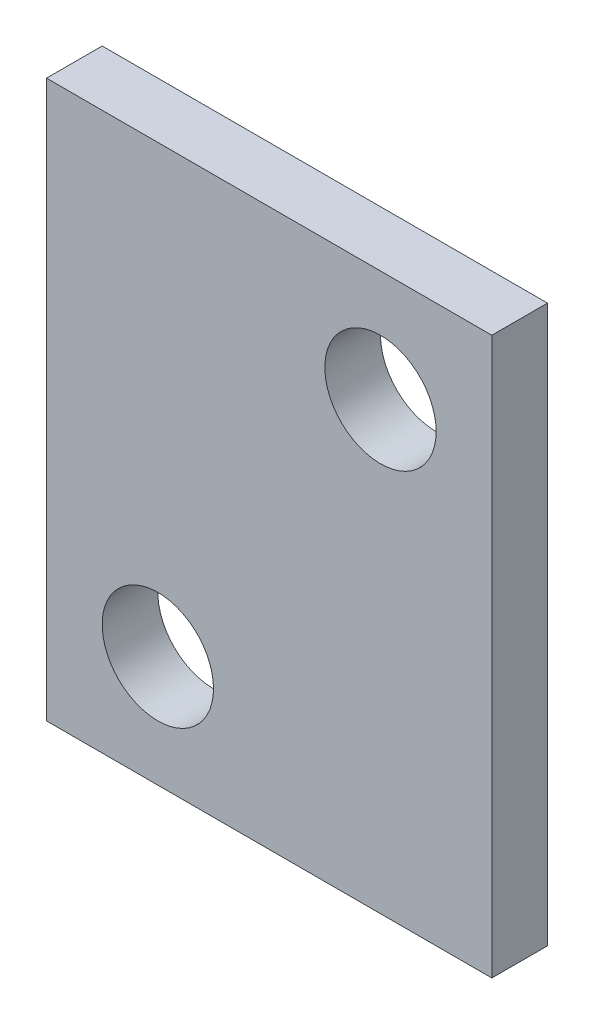
ISO-10303-21;
HEADER;
FILE_DESCRIPTION(('STEP AP214'),'2;1');
FILE_NAME('part.step','',(''),(''),'','','');
FILE_SCHEMA(('AUTOMOTIVE_DESIGN { 1 0 10303 214 1 1 1 1 }'));
ENDSEC;
DATA;
#1=APPLICATION_CONTEXT('core data for automotive mechanical design processes');
#2=APPLICATION_PROTOCOL_DEFINITION('international standard','automotive_design',2000,#1);
#3=PRODUCT_CONTEXT('',#1,'mechanical');
#4=PRODUCT('Part','Part','',(#3));
#5=PRODUCT_RELATED_PRODUCT_CATEGORY('part','',(#4));
#6=PRODUCT_DEFINITION_FORMATION('','',#4);
#7=PRODUCT_DEFINITION_CONTEXT('part definition',#1,'design');
#8=PRODUCT_DEFINITION('design','',#6,#7);
#9=PRODUCT_DEFINITION_SHAPE('','',#8);
#10=(LENGTH_UNIT() NAMED_UNIT(*) SI_UNIT(.MILLI.,.METRE.));
#11=(NAMED_UNIT(*) PLANE_ANGLE_UNIT() SI_UNIT($,.RADIAN.));
#12=(NAMED_UNIT(*) SI_UNIT($,.STERADIAN.) SOLID_ANGLE_UNIT());
#13=UNCERTAINTY_MEASURE_WITH_UNIT(LENGTH_MEASURE(1.E-05),#10,'distance_accuracy_value','');
#14=(GEOMETRIC_REPRESENTATION_CONTEXT(3) GLOBAL_UNCERTAINTY_ASSIGNED_CONTEXT((#13)) GLOBAL_UNIT_ASSIGNED_CONTEXT((#10,
#11,#12)) REPRESENTATION_CONTEXT('',''));
#15=CARTESIAN_POINT('',(0.,0.,0.));
#16=DIRECTION('',(0.,0.,1.));
#17=DIRECTION('',(1.,0.,0.));
#18=AXIS2_PLACEMENT_3D('',#15,#16,#17);
#19=CARTESIAN_POINT('',(-15.520602371608,-4.70345377258236,1.5));
#20=DIRECTION('',(0.,0.,1.));
#21=DIRECTION('',(1.,0.,0.));
#22=AXIS2_PLACEMENT_3D('',#19,#20,#21);
#23=PLANE('',#22);
#24=CARTESIAN_POINT('',(-6.52060237160802,7.29654622741764,1.5));
#25=DIRECTION('',(0.,0.,1.));
#26=DIRECTION('',(1.,0.,0.));
#27=AXIS2_PLACEMENT_3D('',#24,#25,#26);
#28=CIRCLE('',#27,1.5);
#29=CARTESIAN_POINT('',(-5.02060237160802,7.29654622741764,1.5));
#30=VERTEX_POINT('',#29);
#31=EDGE_CURVE('E97',#30,#30,#28,.T.);
#32=ORIENTED_EDGE('',*,*,#31,.F.);
#33=EDGE_LOOP('',(#32));
#34=FACE_BOUND('',#33,.T.);
#35=DIRECTION('',(0.,-1.,0.));
#36=VECTOR('',#35,1.);
#37=CARTESIAN_POINT('',(-15.520602371608,10.2965462274176,1.5));
#38=LINE('',#37,#36);
#39=CARTESIAN_POINT('',(-15.520602371608,10.2965462274176,1.5));
#40=VERTEX_POINT('',#39);
#41=CARTESIAN_POINT('',(-15.520602371608,-4.70345377258236,1.5));
#42=VERTEX_POINT('',#41);
#43=EDGE_CURVE('E82',#40,#42,#38,.T.);
#44=ORIENTED_EDGE('',*,*,#43,.T.);
#45=DIRECTION('',(1.,0.,0.));
#46=VECTOR('',#45,1.);
#47=CARTESIAN_POINT('',(-15.520602371608,-4.70345377258236,1.5));
#48=LINE('',#47,#46);
#49=CARTESIAN_POINT('',(-3.52060237160802,-4.70345377258236,1.5));
#50=VERTEX_POINT('',#49);
#51=EDGE_CURVE('E77',#42,#50,#48,.T.);
#52=ORIENTED_EDGE('',*,*,#51,.T.);
#53=DIRECTION('',(0.,1.,0.));
#54=VECTOR('',#53,1.);
#55=CARTESIAN_POINT('',(-3.52060237160802,10.2965462274176,1.5));
#56=LINE('',#55,#54);
#57=CARTESIAN_POINT('',(-3.52060237160802,10.2965462274176,1.5));
#58=VERTEX_POINT('',#57);
#59=EDGE_CURVE('E80',#50,#58,#56,.T.);
#60=ORIENTED_EDGE('',*,*,#59,.T.);
#61=DIRECTION('',(-1.,0.,0.));
#62=VECTOR('',#61,1.);
#63=CARTESIAN_POINT('',(-15.520602371608,10.2965462274176,1.5));
#64=LINE('',#63,#62);
#65=EDGE_CURVE('E47',#58,#40,#64,.T.);
#66=ORIENTED_EDGE('',*,*,#65,.T.);
#67=EDGE_LOOP('',(#44,#52,#60,#66));
#68=FACE_BOUND('',#67,.T.);
#69=CARTESIAN_POINT('',(-12.520602371608,-1.70345377258236,1.5));
#70=DIRECTION('',(0.,0.,1.));
#71=DIRECTION('',(1.,0.,0.));
#72=AXIS2_PLACEMENT_3D('',#69,#70,#71);
#73=CIRCLE('',#72,1.5);
#74=CARTESIAN_POINT('',(-11.020602371608,-1.70345377258236,1.5));
#75=VERTEX_POINT('',#74);
#76=EDGE_CURVE('E112',#75,#75,#73,.T.);
#77=ORIENTED_EDGE('',*,*,#76,.F.);
#78=EDGE_LOOP('',(#77));
#79=FACE_BOUND('',#78,.T.);
#80=ADVANCED_FACE('F30',(#34,#68,#79),#23,.T.);
#81=CARTESIAN_POINT('',(-15.520602371608,-4.70345377258236,0.));
#82=DIRECTION('',(0.,0.,1.));
#83=DIRECTION('',(1.,0.,0.));
#84=AXIS2_PLACEMENT_3D('',#81,#82,#83);
#85=PLANE('',#84);
#86=CARTESIAN_POINT('',(-6.52060237160802,7.29654622741764,0.));
#87=DIRECTION('',(0.,0.,1.));
#88=DIRECTION('',(1.,0.,0.));
#89=AXIS2_PLACEMENT_3D('',#86,#87,#88);
#90=CIRCLE('',#89,1.5);
#91=CARTESIAN_POINT('',(-5.02060237160802,7.29654622741764,0.));
#92=VERTEX_POINT('',#91);
#93=EDGE_CURVE('E109',#92,#92,#90,.T.);
#94=ORIENTED_EDGE('',*,*,#93,.T.);
#95=EDGE_LOOP('',(#94));
#96=FACE_BOUND('',#95,.T.);
#97=DIRECTION('',(0.,-1.,0.));
#98=VECTOR('',#97,1.);
#99=CARTESIAN_POINT('',(-15.520602371608,10.2965462274176,0.));
#100=LINE('',#99,#98);
#101=CARTESIAN_POINT('',(-15.520602371608,10.2965462274176,0.));
#102=VERTEX_POINT('',#101);
#103=CARTESIAN_POINT('',(-15.520602371608,-4.70345377258236,0.));
#104=VERTEX_POINT('',#103);
#105=EDGE_CURVE('E94',#102,#104,#100,.T.);
#106=ORIENTED_EDGE('',*,*,#105,.F.);
#107=DIRECTION('',(-1.,0.,0.));
#108=VECTOR('',#107,1.);
#109=CARTESIAN_POINT('',(-15.520602371608,10.2965462274176,0.));
#110=LINE('',#109,#108);
#111=CARTESIAN_POINT('',(-3.52060237160802,10.2965462274176,0.));
#112=VERTEX_POINT('',#111);
#113=EDGE_CURVE('E70',#112,#102,#110,.T.);
#114=ORIENTED_EDGE('',*,*,#113,.F.);
#115=DIRECTION('',(0.,1.,0.));
#116=VECTOR('',#115,1.);
#117=CARTESIAN_POINT('',(-3.52060237160802,10.2965462274176,0.));
#118=LINE('',#117,#116);
#119=CARTESIAN_POINT('',(-3.52060237160802,-4.70345377258236,0.));
#120=VERTEX_POINT('',#119);
#121=EDGE_CURVE('E64',#120,#112,#118,.T.);
#122=ORIENTED_EDGE('',*,*,#121,.F.);
#123=DIRECTION('',(1.,0.,0.));
#124=VECTOR('',#123,1.);
#125=CARTESIAN_POINT('',(-15.520602371608,-4.70345377258236,0.));
#126=LINE('',#125,#124);
#127=EDGE_CURVE('E86',#104,#120,#126,.T.);
#128=ORIENTED_EDGE('',*,*,#127,.F.);
#129=EDGE_LOOP('',(#106,#114,#122,#128));
#130=FACE_BOUND('',#129,.T.);
#131=CARTESIAN_POINT('',(-12.520602371608,-1.70345377258236,0.));
#132=DIRECTION('',(0.,0.,1.));
#133=DIRECTION('',(1.,0.,0.));
#134=AXIS2_PLACEMENT_3D('',#131,#132,#133);
#135=CIRCLE('',#134,1.5);
#136=CARTESIAN_POINT('',(-11.020602371608,-1.70345377258236,0.));
#137=VERTEX_POINT('',#136);
#138=EDGE_CURVE('E115',#137,#137,#135,.T.);
#139=ORIENTED_EDGE('',*,*,#138,.T.);
#140=EDGE_LOOP('',(#139));
#141=FACE_BOUND('',#140,.T.);
#142=ADVANCED_FACE('F105',(#96,#130,#141),#85,.F.);
#143=CARTESIAN_POINT('',(-15.520602371608,10.2965462274176,1.5));
#144=DIRECTION('',(1.,0.,0.));
#145=DIRECTION('',(0.,0.,-1.));
#146=AXIS2_PLACEMENT_3D('',#143,#144,#145);
#147=PLANE('',#146);
#148=ORIENTED_EDGE('',*,*,#105,.T.);
#149=DIRECTION('',(0.,0.,-1.));
#150=VECTOR('',#149,1.);
#151=CARTESIAN_POINT('',(-15.520602371608,-4.70345377258236,1.5));
#152=LINE('',#151,#150);
#153=EDGE_CURVE('E11',#42,#104,#152,.T.);
#154=ORIENTED_EDGE('',*,*,#153,.F.);
#155=ORIENTED_EDGE('',*,*,#43,.F.);
#156=DIRECTION('',(0.,0.,-1.));
#157=VECTOR('',#156,1.);
#158=CARTESIAN_POINT('',(-15.520602371608,10.2965462274176,1.5));
#159=LINE('',#158,#157);
#160=EDGE_CURVE('E90',#40,#102,#159,.T.);
#161=ORIENTED_EDGE('',*,*,#160,.T.);
#162=EDGE_LOOP('',(#148,#154,#155,#161));
#163=FACE_BOUND('',#162,.T.);
#164=ADVANCED_FACE('F32',(#163),#147,.F.);
#165=CARTESIAN_POINT('',(-15.520602371608,-4.70345377258236,1.5));
#166=DIRECTION('',(0.,1.,0.));
#167=DIRECTION('',(0.,0.,1.));
#168=AXIS2_PLACEMENT_3D('',#165,#166,#167);
#169=PLANE('',#168);
#170=ORIENTED_EDGE('',*,*,#127,.T.);
#171=DIRECTION('',(0.,0.,-1.));
#172=VECTOR('',#171,1.);
#173=CARTESIAN_POINT('',(-3.52060237160802,-4.70345377258236,1.5));
#174=LINE('',#173,#172);
#175=EDGE_CURVE('E39',#50,#120,#174,.T.);
#176=ORIENTED_EDGE('',*,*,#175,.F.);
#177=ORIENTED_EDGE('',*,*,#51,.F.);
#178=ORIENTED_EDGE('',*,*,#153,.T.);
#179=EDGE_LOOP('',(#170,#176,#177,#178));
#180=FACE_BOUND('',#179,.T.);
#181=ADVANCED_FACE('F85',(#180),#169,.F.);
#182=CARTESIAN_POINT('',(-3.52060237160802,10.2965462274176,1.5));
#183=DIRECTION('',(-1.,0.,0.));
#184=DIRECTION('',(0.,-1.,0.));
#185=AXIS2_PLACEMENT_3D('',#182,#183,#184);
#186=PLANE('',#185);
#187=ORIENTED_EDGE('',*,*,#121,.T.);
#188=DIRECTION('',(0.,0.,-1.));
#189=VECTOR('',#188,1.);
#190=CARTESIAN_POINT('',(-3.52060237160802,10.2965462274176,1.5));
#191=LINE('',#190,#189);
#192=EDGE_CURVE('E87',#58,#112,#191,.T.);
#193=ORIENTED_EDGE('',*,*,#192,.F.);
#194=ORIENTED_EDGE('',*,*,#59,.F.);
#195=ORIENTED_EDGE('',*,*,#175,.T.);
#196=EDGE_LOOP('',(#187,#193,#194,#195));
#197=FACE_BOUND('',#196,.T.);
#198=ADVANCED_FACE('F88',(#197),#186,.F.);
#199=CARTESIAN_POINT('',(-15.520602371608,10.2965462274176,1.5));
#200=DIRECTION('',(0.,-1.,0.));
#201=DIRECTION('',(0.,0.,-1.));
#202=AXIS2_PLACEMENT_3D('',#199,#200,#201);
#203=PLANE('',#202);
#204=ORIENTED_EDGE('',*,*,#113,.T.);
#205=ORIENTED_EDGE('',*,*,#160,.F.);
#206=ORIENTED_EDGE('',*,*,#65,.F.);
#207=ORIENTED_EDGE('',*,*,#192,.T.);
#208=EDGE_LOOP('',(#204,#205,#206,#207));
#209=FACE_BOUND('',#208,.T.);
#210=ADVANCED_FACE('F102',(#209),#203,.F.);
#211=CARTESIAN_POINT('',(-6.52060237160802,7.29654622741764,1.5));
#212=DIRECTION('',(0.,0.,-1.));
#213=DIRECTION('',(-1.,0.,0.));
#214=AXIS2_PLACEMENT_3D('',#211,#212,#213);
#215=CYLINDRICAL_SURFACE('',#214,1.5);
#216=ORIENTED_EDGE('',*,*,#31,.T.);
#217=EDGE_LOOP('',(#216));
#218=FACE_BOUND('',#217,.T.);
#219=ORIENTED_EDGE('',*,*,#93,.F.);
#220=EDGE_LOOP('',(#219));
#221=FACE_BOUND('',#220,.T.);
#222=ADVANCED_FACE('F133',(#218,#221),#215,.F.);
#223=CARTESIAN_POINT('',(-12.520602371608,-1.70345377258236,1.5));
#224=DIRECTION('',(0.,0.,-1.));
#225=DIRECTION('',(-1.,0.,0.));
#226=AXIS2_PLACEMENT_3D('',#223,#224,#225);
#227=CYLINDRICAL_SURFACE('',#226,1.5);
#228=ORIENTED_EDGE('',*,*,#76,.T.);
#229=EDGE_LOOP('',(#228));
#230=FACE_BOUND('',#229,.T.);
#231=ORIENTED_EDGE('',*,*,#138,.F.);
#232=EDGE_LOOP('',(#231));
#233=FACE_BOUND('',#232,.T.);
#234=ADVANCED_FACE('F121',(#230,#233),#227,.F.);
#235=CLOSED_SHELL('',(#80,#142,#164,#181,#198,#210,#222,#234));
#236=MANIFOLD_SOLID_BREP('B2',#235);
#237=ADVANCED_BREP_SHAPE_REPRESENTATION('',(#18,#236),#14);
#238=SHAPE_DEFINITION_REPRESENTATION(#9,#237);
ENDSEC;
END-ISO-10303-21;
